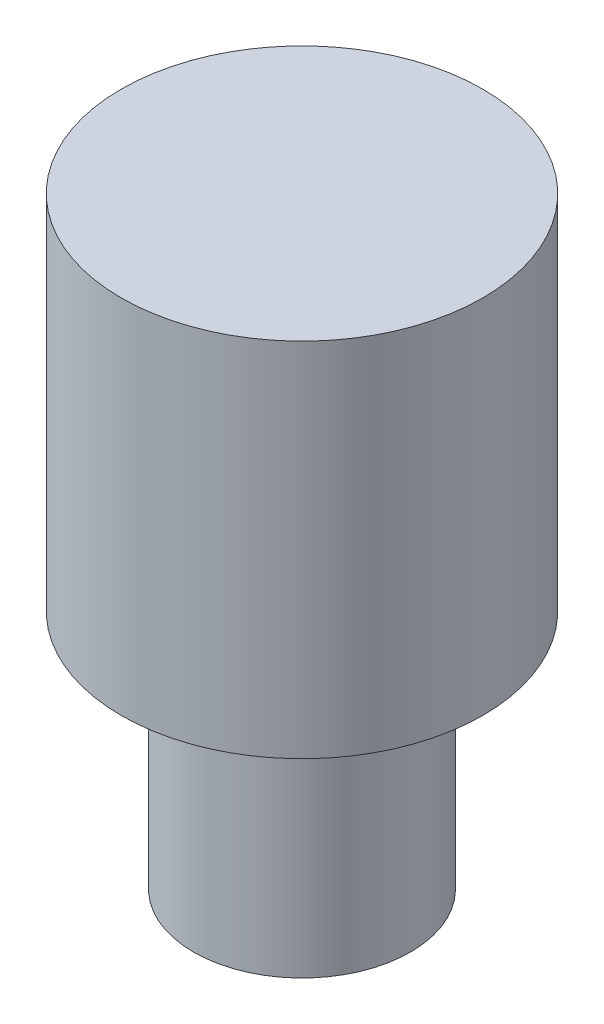
ISO-10303-21;
HEADER;
FILE_DESCRIPTION(('STEP AP214'),'2;1');
FILE_NAME('part.step','',(''),(''),'','','');
FILE_SCHEMA(('AUTOMOTIVE_DESIGN { 1 0 10303 214 1 1 1 1 }'));
ENDSEC;
DATA;
#1=APPLICATION_CONTEXT('core data for automotive mechanical design processes');
#2=APPLICATION_PROTOCOL_DEFINITION('international standard','automotive_design',2000,#1);
#3=PRODUCT_CONTEXT('',#1,'mechanical');
#4=PRODUCT('Part','Part','',(#3));
#5=PRODUCT_RELATED_PRODUCT_CATEGORY('part','',(#4));
#6=PRODUCT_DEFINITION_FORMATION('','',#4);
#7=PRODUCT_DEFINITION_CONTEXT('part definition',#1,'design');
#8=PRODUCT_DEFINITION('design','',#6,#7);
#9=PRODUCT_DEFINITION_SHAPE('','',#8);
#10=(LENGTH_UNIT() NAMED_UNIT(*) SI_UNIT(.MILLI.,.METRE.));
#11=(NAMED_UNIT(*) PLANE_ANGLE_UNIT() SI_UNIT($,.RADIAN.));
#12=(NAMED_UNIT(*) SI_UNIT($,.STERADIAN.) SOLID_ANGLE_UNIT());
#13=UNCERTAINTY_MEASURE_WITH_UNIT(LENGTH_MEASURE(1.E-05),#10,'distance_accuracy_value','');
#14=(GEOMETRIC_REPRESENTATION_CONTEXT(3) GLOBAL_UNCERTAINTY_ASSIGNED_CONTEXT((#13)) GLOBAL_UNIT_ASSIGNED_CONTEXT((#10,
#11,#12)) REPRESENTATION_CONTEXT('',''));
#15=CARTESIAN_POINT('',(0.,0.,0.));
#16=DIRECTION('',(0.,0.,1.));
#17=DIRECTION('',(1.,0.,0.));
#18=AXIS2_PLACEMENT_3D('',#15,#16,#17);
#19=CARTESIAN_POINT('',(0.,50.,0.));
#20=DIRECTION('',(0.,-1.,0.));
#21=DIRECTION('',(0.,0.,-1.));
#22=AXIS2_PLACEMENT_3D('',#19,#20,#21);
#23=CYLINDRICAL_SURFACE('',#22,15.);
#24=CARTESIAN_POINT('',(0.,50.,0.));
#25=DIRECTION('',(0.,1.,0.));
#26=DIRECTION('',(0.,0.,1.));
#27=AXIS2_PLACEMENT_3D('',#24,#25,#26);
#28=CIRCLE('',#27,15.);
#29=CARTESIAN_POINT('',(0.,50.,15.));
#30=VERTEX_POINT('',#29);
#31=EDGE_CURVE('E11',#30,#30,#28,.T.);
#32=ORIENTED_EDGE('',*,*,#31,.F.);
#33=EDGE_LOOP('',(#32));
#34=FACE_BOUND('',#33,.T.);
#35=CARTESIAN_POINT('',(0.,20.,0.));
#36=DIRECTION('',(0.,1.,0.));
#37=DIRECTION('',(0.,0.,1.));
#38=AXIS2_PLACEMENT_3D('',#35,#36,#37);
#39=CIRCLE('',#38,15.);
#40=CARTESIAN_POINT('',(0.,20.,15.));
#41=VERTEX_POINT('',#40);
#42=EDGE_CURVE('E50',#41,#41,#39,.T.);
#43=ORIENTED_EDGE('',*,*,#42,.T.);
#44=EDGE_LOOP('',(#43));
#45=FACE_BOUND('',#44,.T.);
#46=ADVANCED_FACE('F47',(#34,#45),#23,.T.);
#47=CARTESIAN_POINT('',(0.,50.,0.));
#48=DIRECTION('',(0.,1.,0.));
#49=DIRECTION('',(0.,0.,1.));
#50=AXIS2_PLACEMENT_3D('',#47,#48,#49);
#51=PLANE('',#50);
#52=ORIENTED_EDGE('',*,*,#31,.T.);
#53=EDGE_LOOP('',(#52));
#54=FACE_BOUND('',#53,.T.);
#55=ADVANCED_FACE('F62',(#54),#51,.T.);
#56=CARTESIAN_POINT('',(0.,20.,0.));
#57=DIRECTION('',(0.,1.,0.));
#58=DIRECTION('',(0.,0.,1.));
#59=AXIS2_PLACEMENT_3D('',#56,#57,#58);
#60=PLANE('',#59);
#61=ORIENTED_EDGE('',*,*,#42,.F.);
#62=EDGE_LOOP('',(#61));
#63=FACE_BOUND('',#62,.T.);
#64=ADVANCED_FACE('F60',(#63),#60,.F.);
#65=CLOSED_SHELL('',(#46,#55,#64));
#66=MANIFOLD_SOLID_BREP('B2',#65);
#67=CARTESIAN_POINT('',(0.,20.,0.));
#68=DIRECTION('',(0.,-1.,0.));
#69=DIRECTION('',(0.,0.,-1.));
#70=AXIS2_PLACEMENT_3D('',#67,#68,#69);
#71=CYLINDRICAL_SURFACE('',#70,9.);
#72=CARTESIAN_POINT('',(0.,20.,0.));
#73=DIRECTION('',(0.,1.,0.));
#74=DIRECTION('',(0.,0.,1.));
#75=AXIS2_PLACEMENT_3D('',#72,#73,#74);
#76=CIRCLE('',#75,9.);
#77=CARTESIAN_POINT('',(0.,20.,9.));
#78=VERTEX_POINT('',#77);
#79=EDGE_CURVE('E46',#78,#78,#76,.T.);
#80=ORIENTED_EDGE('',*,*,#79,.F.);
#81=EDGE_LOOP('',(#80));
#82=FACE_BOUND('',#81,.T.);
#83=CARTESIAN_POINT('',(0.,0.,0.));
#84=DIRECTION('',(0.,1.,0.));
#85=DIRECTION('',(0.,0.,1.));
#86=AXIS2_PLACEMENT_3D('',#83,#84,#85);
#87=CIRCLE('',#86,9.);
#88=CARTESIAN_POINT('',(0.,0.,9.));
#89=VERTEX_POINT('',#88);
#90=EDGE_CURVE('E97',#89,#89,#87,.T.);
#91=ORIENTED_EDGE('',*,*,#90,.T.);
#92=EDGE_LOOP('',(#91));
#93=FACE_BOUND('',#92,.T.);
#94=ADVANCED_FACE('F94',(#82,#93),#71,.T.);
#95=CARTESIAN_POINT('',(0.,20.,0.));
#96=DIRECTION('',(0.,1.,0.));
#97=DIRECTION('',(0.,0.,1.));
#98=AXIS2_PLACEMENT_3D('',#95,#96,#97);
#99=PLANE('',#98);
#100=ORIENTED_EDGE('',*,*,#79,.T.);
#101=EDGE_LOOP('',(#100));
#102=FACE_BOUND('',#101,.T.);
#103=ADVANCED_FACE('F109',(#102),#99,.T.);
#104=CARTESIAN_POINT('',(0.,0.,0.));
#105=DIRECTION('',(0.,1.,0.));
#106=DIRECTION('',(0.,0.,1.));
#107=AXIS2_PLACEMENT_3D('',#104,#105,#106);
#108=PLANE('',#107);
#109=ORIENTED_EDGE('',*,*,#90,.F.);
#110=EDGE_LOOP('',(#109));
#111=FACE_BOUND('',#110,.T.);
#112=ADVANCED_FACE('F107',(#111),#108,.F.);
#113=CLOSED_SHELL('',(#94,#103,#112));
#114=MANIFOLD_SOLID_BREP('B6_NOT_SHOWN',#113);
#115=ADVANCED_BREP_SHAPE_REPRESENTATION('',(#18,#66,#114),#14);
#116=SHAPE_DEFINITION_REPRESENTATION(#9,#115);
ENDSEC;
END-ISO-10303-21;
